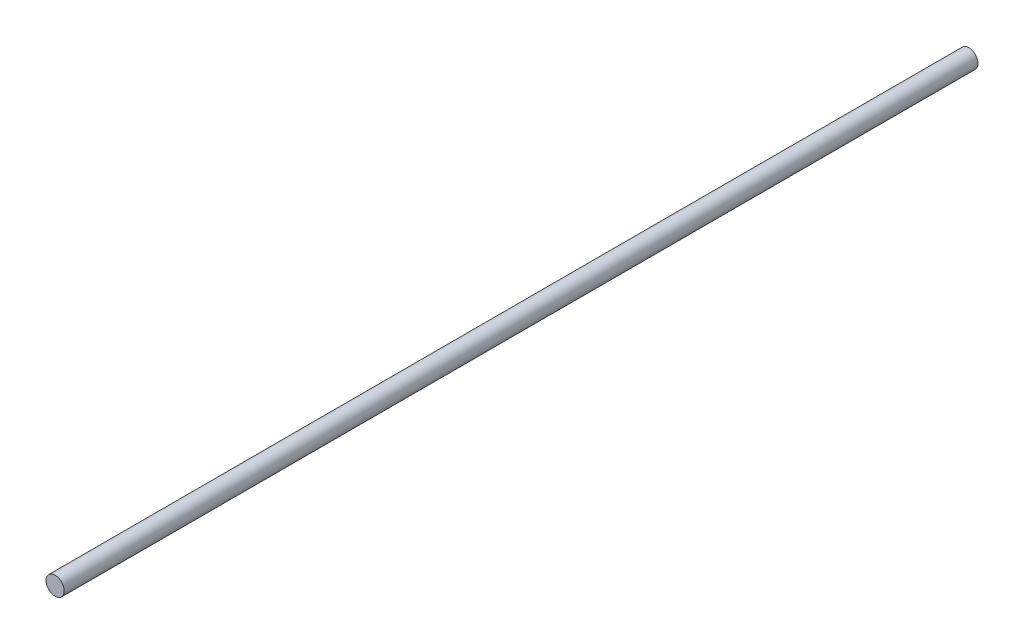
ISO-10303-21;
HEADER;
FILE_DESCRIPTION(('STEP AP214'),'2;1');
FILE_NAME('part.step','',(''),(''),'','','');
FILE_SCHEMA(('AUTOMOTIVE_DESIGN { 1 0 10303 214 1 1 1 1 }'));
ENDSEC;
DATA;
#1=APPLICATION_CONTEXT('core data for automotive mechanical design processes');
#2=APPLICATION_PROTOCOL_DEFINITION('international standard','automotive_design',2000,#1);
#3=PRODUCT_CONTEXT('',#1,'mechanical');
#4=PRODUCT('Part','Part','',(#3));
#5=PRODUCT_RELATED_PRODUCT_CATEGORY('part','',(#4));
#6=PRODUCT_DEFINITION_FORMATION('','',#4);
#7=PRODUCT_DEFINITION_CONTEXT('part definition',#1,'design');
#8=PRODUCT_DEFINITION('design','',#6,#7);
#9=PRODUCT_DEFINITION_SHAPE('','',#8);
#10=(LENGTH_UNIT() NAMED_UNIT(*) SI_UNIT(.MILLI.,.METRE.));
#11=(NAMED_UNIT(*) PLANE_ANGLE_UNIT() SI_UNIT($,.RADIAN.));
#12=(NAMED_UNIT(*) SI_UNIT($,.STERADIAN.) SOLID_ANGLE_UNIT());
#13=UNCERTAINTY_MEASURE_WITH_UNIT(LENGTH_MEASURE(1.E-05),#10,'distance_accuracy_value','');
#14=(GEOMETRIC_REPRESENTATION_CONTEXT(3) GLOBAL_UNCERTAINTY_ASSIGNED_CONTEXT((#13)) GLOBAL_UNIT_ASSIGNED_CONTEXT((#10,
#11,#12)) REPRESENTATION_CONTEXT('',''));
#15=CARTESIAN_POINT('',(0.,0.,0.));
#16=DIRECTION('',(0.,0.,1.));
#17=DIRECTION('',(1.,0.,0.));
#18=AXIS2_PLACEMENT_3D('',#15,#16,#17);
#19=CARTESIAN_POINT('',(0.,0.,1500.));
#20=DIRECTION('',(0.,0.,-1.));
#21=DIRECTION('',(-1.,0.,0.));
#22=AXIS2_PLACEMENT_3D('',#19,#20,#21);
#23=CYLINDRICAL_SURFACE('',#22,15.);
#24=CARTESIAN_POINT('',(0.,0.,1500.));
#25=DIRECTION('',(0.,0.,1.));
#26=DIRECTION('',(1.,0.,0.));
#27=AXIS2_PLACEMENT_3D('',#24,#25,#26);
#28=CIRCLE('',#27,15.);
#29=CARTESIAN_POINT('',(15.,0.,1500.));
#30=VERTEX_POINT('',#29);
#31=EDGE_CURVE('E10',#30,#30,#28,.T.);
#32=ORIENTED_EDGE('',*,*,#31,.F.);
#33=EDGE_LOOP('',(#32));
#34=FACE_BOUND('',#33,.T.);
#35=CARTESIAN_POINT('',(0.,0.,0.));
#36=DIRECTION('',(0.,0.,1.));
#37=DIRECTION('',(1.,0.,0.));
#38=AXIS2_PLACEMENT_3D('',#35,#36,#37);
#39=CIRCLE('',#38,15.);
#40=CARTESIAN_POINT('',(15.,0.,0.));
#41=VERTEX_POINT('',#40);
#42=EDGE_CURVE('E34',#41,#41,#39,.T.);
#43=ORIENTED_EDGE('',*,*,#42,.T.);
#44=EDGE_LOOP('',(#43));
#45=FACE_BOUND('',#44,.T.);
#46=ADVANCED_FACE('F31',(#34,#45),#23,.T.);
#47=CARTESIAN_POINT('',(0.,0.,1500.));
#48=DIRECTION('',(0.,0.,1.));
#49=DIRECTION('',(1.,0.,0.));
#50=AXIS2_PLACEMENT_3D('',#47,#48,#49);
#51=PLANE('',#50);
#52=ORIENTED_EDGE('',*,*,#31,.T.);
#53=EDGE_LOOP('',(#52));
#54=FACE_BOUND('',#53,.T.);
#55=ADVANCED_FACE('F46',(#54),#51,.T.);
#56=CARTESIAN_POINT('',(0.,0.,0.));
#57=DIRECTION('',(0.,0.,1.));
#58=DIRECTION('',(1.,0.,0.));
#59=AXIS2_PLACEMENT_3D('',#56,#57,#58);
#60=PLANE('',#59);
#61=ORIENTED_EDGE('',*,*,#42,.F.);
#62=EDGE_LOOP('',(#61));
#63=FACE_BOUND('',#62,.T.);
#64=ADVANCED_FACE('F44',(#63),#60,.F.);
#65=CLOSED_SHELL('',(#46,#55,#64));
#66=MANIFOLD_SOLID_BREP('B2',#65);
#67=ADVANCED_BREP_SHAPE_REPRESENTATION('',(#18,#66),#14);
#68=SHAPE_DEFINITION_REPRESENTATION(#9,#67);
ENDSEC;
END-ISO-10303-21;
